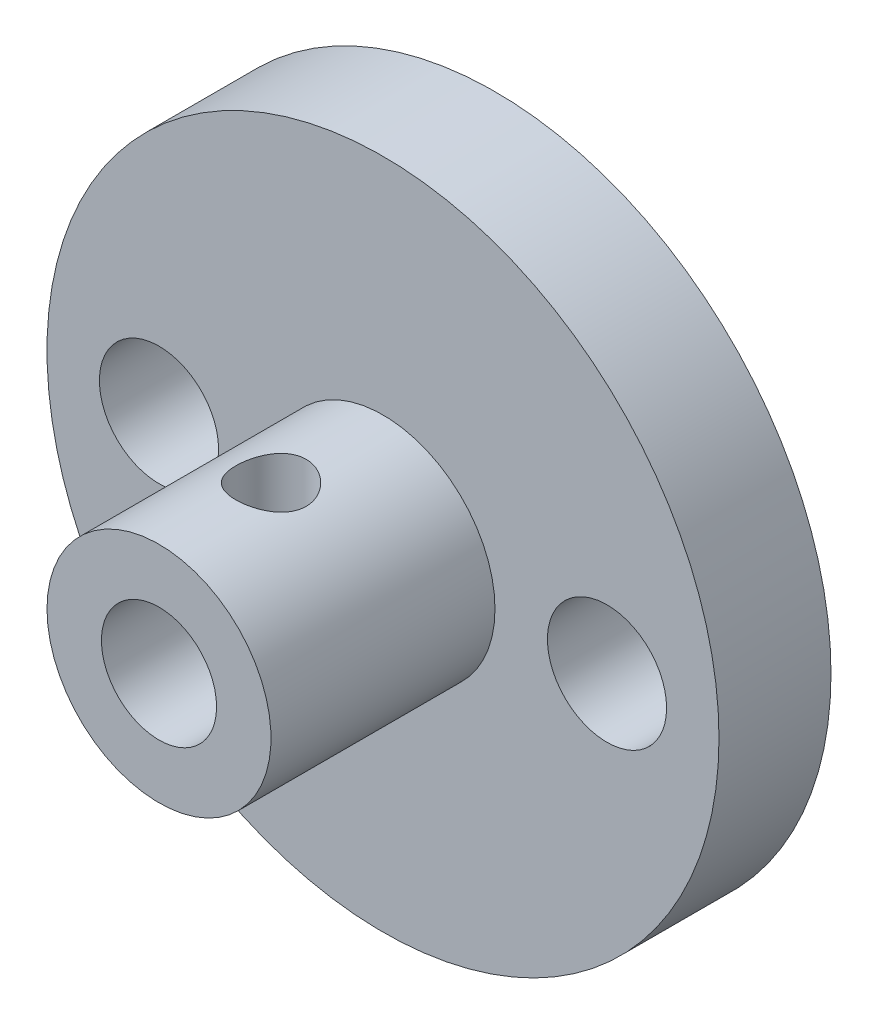
ISO-10303-21;
HEADER;
FILE_DESCRIPTION(('STEP AP214'),'2;1');
FILE_NAME('part.step','',(''),(''),'','','');
FILE_SCHEMA(('AUTOMOTIVE_DESIGN { 1 0 10303 214 1 1 1 1 }'));
ENDSEC;
DATA;
#1=APPLICATION_CONTEXT('core data for automotive mechanical design processes');
#2=APPLICATION_PROTOCOL_DEFINITION('international standard','automotive_design',2000,#1);
#3=PRODUCT_CONTEXT('',#1,'mechanical');
#4=PRODUCT('Part','Part','',(#3));
#5=PRODUCT_RELATED_PRODUCT_CATEGORY('part','',(#4));
#6=PRODUCT_DEFINITION_FORMATION('','',#4);
#7=PRODUCT_DEFINITION_CONTEXT('part definition',#1,'design');
#8=PRODUCT_DEFINITION('design','',#6,#7);
#9=PRODUCT_DEFINITION_SHAPE('','',#8);
#10=(LENGTH_UNIT() NAMED_UNIT(*) SI_UNIT(.MILLI.,.METRE.));
#11=(NAMED_UNIT(*) PLANE_ANGLE_UNIT() SI_UNIT($,.RADIAN.));
#12=(NAMED_UNIT(*) SI_UNIT($,.STERADIAN.) SOLID_ANGLE_UNIT());
#13=UNCERTAINTY_MEASURE_WITH_UNIT(LENGTH_MEASURE(1.E-05),#10,'distance_accuracy_value','');
#14=(GEOMETRIC_REPRESENTATION_CONTEXT(3) GLOBAL_UNCERTAINTY_ASSIGNED_CONTEXT((#13)) GLOBAL_UNIT_ASSIGNED_CONTEXT((#10,
#11,#12)) REPRESENTATION_CONTEXT('',''));
#15=CARTESIAN_POINT('',(0.,0.,0.));
#16=DIRECTION('',(0.,0.,1.));
#17=DIRECTION('',(1.,0.,0.));
#18=AXIS2_PLACEMENT_3D('',#15,#16,#17);
#19=CARTESIAN_POINT('',(0.,0.,6.35));
#20=DIRECTION('',(0.,0.,-1.));
#21=DIRECTION('',(-1.,0.,0.));
#22=AXIS2_PLACEMENT_3D('',#19,#20,#21);
#23=CYLINDRICAL_SURFACE('',#22,19.05);
#24=CARTESIAN_POINT('',(0.,0.,6.35));
#25=DIRECTION('',(0.,0.,1.));
#26=DIRECTION('',(1.,0.,0.));
#27=AXIS2_PLACEMENT_3D('',#24,#25,#26);
#28=CIRCLE('',#27,19.05);
#29=CARTESIAN_POINT('',(19.05,0.,6.35));
#30=VERTEX_POINT('',#29);
#31=EDGE_CURVE('E51',#30,#30,#28,.T.);
#32=ORIENTED_EDGE('',*,*,#31,.F.);
#33=EDGE_LOOP('',(#32));
#34=FACE_BOUND('',#33,.T.);
#35=CARTESIAN_POINT('',(0.,0.,0.));
#36=DIRECTION('',(0.,0.,1.));
#37=DIRECTION('',(1.,0.,0.));
#38=AXIS2_PLACEMENT_3D('',#35,#36,#37);
#39=CIRCLE('',#38,19.05);
#40=CARTESIAN_POINT('',(19.05,0.,0.));
#41=VERTEX_POINT('',#40);
#42=EDGE_CURVE('E56',#41,#41,#39,.T.);
#43=ORIENTED_EDGE('',*,*,#42,.T.);
#44=EDGE_LOOP('',(#43));
#45=FACE_BOUND('',#44,.T.);
#46=ADVANCED_FACE('F36',(#34,#45),#23,.T.);
#47=CARTESIAN_POINT('',(0.,0.,6.35));
#48=DIRECTION('',(0.,0.,1.));
#49=DIRECTION('',(1.,0.,0.));
#50=AXIS2_PLACEMENT_3D('',#47,#48,#49);
#51=PLANE('',#50);
#52=CARTESIAN_POINT('',(-12.7,0.,6.35));
#53=DIRECTION('',(0.,0.,1.));
#54=DIRECTION('',(1.,0.,0.));
#55=AXIS2_PLACEMENT_3D('',#52,#53,#54);
#56=CIRCLE('',#55,3.3782);
#57=CARTESIAN_POINT('',(-9.3218,0.,6.35));
#58=VERTEX_POINT('',#57);
#59=EDGE_CURVE('E188',#58,#58,#56,.T.);
#60=ORIENTED_EDGE('',*,*,#59,.F.);
#61=EDGE_LOOP('',(#60));
#62=FACE_BOUND('',#61,.T.);
#63=CARTESIAN_POINT('',(12.7,0.,6.35));
#64=DIRECTION('',(0.,0.,1.));
#65=DIRECTION('',(1.,0.,0.));
#66=AXIS2_PLACEMENT_3D('',#63,#64,#65);
#67=CIRCLE('',#66,3.3782);
#68=CARTESIAN_POINT('',(16.0782,0.,6.35));
#69=VERTEX_POINT('',#68);
#70=EDGE_CURVE('E192',#69,#69,#67,.T.);
#71=ORIENTED_EDGE('',*,*,#70,.F.);
#72=EDGE_LOOP('',(#71));
#73=FACE_BOUND('',#72,.T.);
#74=CARTESIAN_POINT('',(0.,0.,6.35));
#75=DIRECTION('',(0.,0.,1.));
#76=DIRECTION('',(1.,0.,0.));
#77=AXIS2_PLACEMENT_3D('',#74,#75,#76);
#78=CIRCLE('',#77,6.35);
#79=CARTESIAN_POINT('',(6.35,0.,6.35));
#80=VERTEX_POINT('',#79);
#81=EDGE_CURVE('E47',#80,#80,#78,.T.);
#82=ORIENTED_EDGE('',*,*,#81,.F.);
#83=EDGE_LOOP('',(#82));
#84=FACE_BOUND('',#83,.T.);
#85=ORIENTED_EDGE('',*,*,#31,.T.);
#86=EDGE_LOOP('',(#85));
#87=FACE_BOUND('',#86,.T.);
#88=ADVANCED_FACE('F104',(#62,#73,#84,#87),#51,.T.);
#89=CARTESIAN_POINT('',(0.,0.,0.));
#90=DIRECTION('',(0.,0.,1.));
#91=DIRECTION('',(1.,0.,0.));
#92=AXIS2_PLACEMENT_3D('',#89,#90,#91);
#93=PLANE('',#92);
#94=CARTESIAN_POINT('',(-12.7,0.,0.));
#95=DIRECTION('',(0.,0.,1.));
#96=DIRECTION('',(1.,0.,0.));
#97=AXIS2_PLACEMENT_3D('',#94,#95,#96);
#98=CIRCLE('',#97,3.3782);
#99=CARTESIAN_POINT('',(-9.3218,0.,0.));
#100=VERTEX_POINT('',#99);
#101=EDGE_CURVE('E194',#100,#100,#98,.T.);
#102=ORIENTED_EDGE('',*,*,#101,.T.);
#103=EDGE_LOOP('',(#102));
#104=FACE_BOUND('',#103,.T.);
#105=CARTESIAN_POINT('',(12.7,0.,0.));
#106=DIRECTION('',(0.,0.,1.));
#107=DIRECTION('',(1.,0.,0.));
#108=AXIS2_PLACEMENT_3D('',#105,#106,#107);
#109=CIRCLE('',#108,3.3782);
#110=CARTESIAN_POINT('',(16.0782,0.,0.));
#111=VERTEX_POINT('',#110);
#112=EDGE_CURVE('E82',#111,#111,#109,.T.);
#113=ORIENTED_EDGE('',*,*,#112,.T.);
#114=EDGE_LOOP('',(#113));
#115=FACE_BOUND('',#114,.T.);
#116=CARTESIAN_POINT('',(0.,0.,0.));
#117=DIRECTION('',(0.,0.,1.));
#118=DIRECTION('',(1.,0.,0.));
#119=AXIS2_PLACEMENT_3D('',#116,#117,#118);
#120=CIRCLE('',#119,3.2639);
#121=CARTESIAN_POINT('',(3.2639,0.,0.));
#122=VERTEX_POINT('',#121);
#123=EDGE_CURVE('E65',#122,#122,#120,.T.);
#124=ORIENTED_EDGE('',*,*,#123,.T.);
#125=EDGE_LOOP('',(#124));
#126=FACE_BOUND('',#125,.T.);
#127=ORIENTED_EDGE('',*,*,#42,.F.);
#128=EDGE_LOOP('',(#127));
#129=FACE_BOUND('',#128,.T.);
#130=ADVANCED_FACE('F109',(#104,#115,#126,#129),#93,.F.);
#131=CARTESIAN_POINT('',(0.,0.,19.05));
#132=DIRECTION('',(0.,0.,-1.));
#133=DIRECTION('',(-1.,0.,0.));
#134=AXIS2_PLACEMENT_3D('',#131,#132,#133);
#135=CYLINDRICAL_SURFACE('',#134,6.35);
#136=CARTESIAN_POINT('',(0.,6.35,14.6939));
#137=CARTESIAN_POINT('',(0.109142424515965,6.34999950864101,14.6938993668474));
#138=CARTESIAN_POINT('',(0.218291585608996,6.34715960731566,14.684909111883));
#139=CARTESIAN_POINT('',(0.433396308370141,6.33610901299259,14.6492809866341));
#140=CARTESIAN_POINT('',(0.539351169773904,6.32789715116519,14.6226392757346));
#141=CARTESIAN_POINT('',(0.744934413045787,6.3069993872693,14.552696391505));
#142=CARTESIAN_POINT('',(0.844572363181503,6.29432045228127,14.5094211511906));
#143=CARTESIAN_POINT('',(1.03517750977861,6.26579660211444,14.4075504519169));
#144=CARTESIAN_POINT('',(1.12614331146468,6.24995117892164,14.3489525342053));
#145=CARTESIAN_POINT('',(1.29965595125812,6.21622322872785,14.216178728609));
#146=CARTESIAN_POINT('',(1.38189478048642,6.19829600400891,14.141611724822));
#147=CARTESIAN_POINT('',(1.53292935990833,6.16268293115634,13.9798491093218));
#148=CARTESIAN_POINT('',(1.60172257683863,6.14499712909144,13.8926511232062));
#149=CARTESIAN_POINT('',(1.72558939289344,6.1113888869269,13.7054278853662));
#150=CARTESIAN_POINT('',(1.78027712295014,6.09552156642879,13.605136508551));
#151=CARTESIAN_POINT('',(1.87188188811815,6.06801963542741,13.3962014952945));
#152=CARTESIAN_POINT('',(1.90880365565063,6.05638389793504,13.28756009205));
#153=CARTESIAN_POINT('',(1.96269938178266,6.03913033239249,13.0684865809423));
#154=CARTESIAN_POINT('',(1.98024511401063,6.03334046860898,12.958209066904));
#155=CARTESIAN_POINT('',(1.99667709691487,6.02792354991424,12.7361352417599));
#156=CARTESIAN_POINT('',(1.9955683630919,6.02829483849507,12.6243393469678));
#157=CARTESIAN_POINT('',(1.97516986158077,6.03500649567724,12.4071420175023));
#158=CARTESIAN_POINT('',(1.95660826619276,6.0411077838206,12.3016635604642));
#159=CARTESIAN_POINT('',(1.90301207506858,6.05820338859783,12.0954009171418));
#160=CARTESIAN_POINT('',(1.86797571324095,6.0691982298128,11.9946172354098));
#161=CARTESIAN_POINT('',(1.78191297292662,6.0950244200429,11.7988760111877));
#162=CARTESIAN_POINT('',(1.73065885678711,6.10990984982951,11.7040260413856));
#163=CARTESIAN_POINT('',(1.61377367933569,6.1418153759652,11.5240347664144));
#164=CARTESIAN_POINT('',(1.54813885324998,6.15883603080226,11.4388960124684));
#165=CARTESIAN_POINT('',(1.40078753893692,6.1940520371408,11.2766289993537));
#166=CARTESIAN_POINT('',(1.31847032025457,6.21226541453812,11.2000491514585));
#167=CARTESIAN_POINT('',(1.14193548893161,6.24712474923217,11.0616468329664));
#168=CARTESIAN_POINT('',(1.04771697843552,6.26377058810534,10.9998254767954));
#169=CARTESIAN_POINT('',(0.848989774607568,6.29379700685041,10.8923186185269));
#170=CARTESIAN_POINT('',(0.744405361134727,6.30715062882562,10.8467650468401));
#171=CARTESIAN_POINT('',(0.528540975789286,6.3288933580691,10.7740609072686));
#172=CARTESIAN_POINT('',(0.417263068780103,6.33728398779624,10.7469046953959));
#173=CARTESIAN_POINT('',(0.195824653860993,6.34790984564657,10.7127029485796));
#174=CARTESIAN_POINT('',(0.0857895291263954,6.35037215977706,10.7049150969045));
#175=CARTESIAN_POINT('',(-0.134027760762552,6.34953622865711,10.707576669356));
#176=CARTESIAN_POINT('',(-0.243809960868123,6.34623883391432,10.7180234008719));
#177=CARTESIAN_POINT('',(-0.457134314653854,6.33440325692757,10.7562622339418));
#178=CARTESIAN_POINT('',(-0.560763959057499,6.3259989155422,10.7836116589746));
#179=CARTESIAN_POINT('',(-0.761933820558179,6.30493416905284,10.8543384443772));
#180=CARTESIAN_POINT('',(-0.859473281703205,6.29227323683426,10.8977177898768));
#181=CARTESIAN_POINT('',(-1.04835505145096,6.26360971884873,11.0004617190473));
#182=CARTESIAN_POINT('',(-1.13948670880164,6.24753279464779,11.0601922471443));
#183=CARTESIAN_POINT('',(-1.31068174676028,6.21387461170749,11.1935046233422));
#184=CARTESIAN_POINT('',(-1.39074208769878,6.19629294197134,11.2670902623695));
#185=CARTESIAN_POINT('',(-1.5408492519811,6.16072053435969,11.4295156440242));
#186=CARTESIAN_POINT('',(-1.61036692960277,6.14274159533369,11.5188481037609));
#187=CARTESIAN_POINT('',(-1.73347348962847,6.10914524923092,11.7083012131996));
#188=CARTESIAN_POINT('',(-1.78706260211608,6.09352780804459,11.8084217070431));
#189=CARTESIAN_POINT('',(-1.87646264341368,6.06659483531378,12.0164174000687));
#190=CARTESIAN_POINT('',(-1.91234045734819,6.05526315750055,12.1242616356953));
#191=CARTESIAN_POINT('',(-1.96529675070837,6.03828593574938,12.3448900786379));
#192=CARTESIAN_POINT('',(-1.98238247291594,6.03263820119737,12.4576723653085));
#193=CARTESIAN_POINT('',(-1.99674622415629,6.02789807649294,12.6794394758629));
#194=CARTESIAN_POINT('',(-1.99489300505472,6.02851815929831,12.788362575933));
#195=CARTESIAN_POINT('',(-1.97353154453667,6.03554444806881,13.0042637531758));
#196=CARTESIAN_POINT('',(-1.95402414162338,6.04195037922924,13.111241922479));
#197=CARTESIAN_POINT('',(-1.89849203852647,6.05962471072329,13.3186465897941));
#198=CARTESIAN_POINT('',(-1.86271821828398,6.07081910764052,13.4191470442401));
#199=CARTESIAN_POINT('',(-1.77586667739018,6.09678953009283,13.6127992781912));
#200=CARTESIAN_POINT('',(-1.72478582227171,6.1115662890804,13.7059495476366));
#201=CARTESIAN_POINT('',(-1.60641400397725,6.14376367421098,13.8862351943301));
#202=CARTESIAN_POINT('',(-1.53856309174027,6.16126559865635,13.9729883606489));
#203=CARTESIAN_POINT('',(-1.38955976877091,6.19656983110279,14.1341587273513));
#204=CARTESIAN_POINT('',(-1.30840378654074,6.21437221860339,14.2085726046653));
#205=CARTESIAN_POINT('',(-1.13186415961229,6.2489780563446,14.3454175883287));
#206=CARTESIAN_POINT('',(-1.03609865622246,6.26572897702007,14.4073708449297));
#207=CARTESIAN_POINT('',(-0.83498677166474,6.2956817456949,14.5142180251358));
#208=CARTESIAN_POINT('',(-0.729644086746069,6.30888495519298,14.5591184958007));
#209=CARTESIAN_POINT('',(-0.52126180163263,6.32936307555888,14.6274195048582));
#210=CARTESIAN_POINT('',(-0.418737660862818,6.33703431743766,14.6522773289142));
#211=CARTESIAN_POINT('',(-0.210810707580629,6.34735249690425,14.6855161768332));
#212=CARTESIAN_POINT('',(-0.105408495552603,6.35000047454886,14.6939006114915));
#213=CARTESIAN_POINT('',(0.,6.35,14.6939));
#214=B_SPLINE_CURVE_WITH_KNOTS('',3,(#136,#137,#138,#139,#140,#141,#142,#143,#144,#145,#146,
#147,#148,#149,#150,#151,#152,#153,#154,#155,#156,#157,#158,#159,#160,#161,#162,#163,#164,#165,
#166,#167,#168,#169,#170,#171,#172,#173,#174,#175,#176,#177,#178,#179,#180,#181,#182,#183,#184,
#185,#186,#187,#188,#189,#190,#191,#192,#193,#194,#195,#196,#197,#198,#199,#200,#201,#202,#203,
#204,#205,#206,#207,#208,#209,#210,#211,#212,#213),.UNSPECIFIED.,.T.,.F.,(4,2,2,2,2,2,2,2,2,2,2,
2,2,2,2,2,2,2,2,2,2,2,2,2,2,2,2,2,2,2,2,2,2,2,2,2,2,2,4),(0.,0.327039794601109,
0.654150770107317,0.980753808386344,1.30740928719355,1.6432343318785,1.97912258788404,
2.32340575728383,2.66759716716544,3.00133523160018,3.33498356756126,3.65530136581391,
3.97565350989725,4.30072030017859,4.62587229267335,4.96597665694514,5.3061066946611,
5.64893566173839,5.99165940720171,6.32103016563061,6.65035229162463,6.97139504967186,
7.29247757867589,7.62143461219055,7.9504817834778,8.29270103060333,8.63491533422927,
8.97582721691089,9.31660766044098,9.64182893700888,9.96703476767652,10.2873866370494,
10.6078041507082,10.9408610188357,11.2740074366891,11.6181749211563,11.962210135834,
12.2781268168495,12.5939780808068),.UNSPECIFIED.);
#215=CARTESIAN_POINT('',(0.,6.35,14.6939));
#216=VERTEX_POINT('',#215);
#217=EDGE_CURVE('E10',#216,#216,#214,.T.);
#218=ORIENTED_EDGE('',*,*,#217,.F.);
#219=EDGE_LOOP('',(#218));
#220=FACE_BOUND('',#219,.T.);
#221=ORIENTED_EDGE('',*,*,#81,.T.);
#222=EDGE_LOOP('',(#221));
#223=FACE_BOUND('',#222,.T.);
#224=CARTESIAN_POINT('',(0.,0.,19.05));
#225=DIRECTION('',(0.,0.,-1.));
#226=DIRECTION('',(-1.,0.,0.));
#227=AXIS2_PLACEMENT_3D('',#224,#225,#226);
#228=CIRCLE('',#227,6.35);
#229=CARTESIAN_POINT('',(-6.35,0.,19.05));
#230=VERTEX_POINT('',#229);
#231=EDGE_CURVE('E59',#230,#230,#228,.T.);
#232=ORIENTED_EDGE('',*,*,#231,.T.);
#233=EDGE_LOOP('',(#232));
#234=FACE_BOUND('',#233,.T.);
#235=ADVANCED_FACE('F117',(#220,#223,#234),#135,.T.);
#236=CARTESIAN_POINT('',(0.,0.,19.05));
#237=DIRECTION('',(0.,0.,-1.));
#238=DIRECTION('',(-1.,0.,0.));
#239=AXIS2_PLACEMENT_3D('',#236,#237,#238);
#240=PLANE('',#239);
#241=CARTESIAN_POINT('',(0.,0.,19.05));
#242=DIRECTION('',(0.,0.,1.));
#243=DIRECTION('',(1.,0.,0.));
#244=AXIS2_PLACEMENT_3D('',#241,#242,#243);
#245=CIRCLE('',#244,3.2639);
#246=CARTESIAN_POINT('',(3.2639,0.,19.05));
#247=VERTEX_POINT('',#246);
#248=EDGE_CURVE('E69',#247,#247,#245,.T.);
#249=ORIENTED_EDGE('',*,*,#248,.F.);
#250=EDGE_LOOP('',(#249));
#251=FACE_BOUND('',#250,.T.);
#252=ORIENTED_EDGE('',*,*,#231,.F.);
#253=EDGE_LOOP('',(#252));
#254=FACE_BOUND('',#253,.T.);
#255=ADVANCED_FACE('F123',(#251,#254),#240,.F.);
#256=CARTESIAN_POINT('',(0.,0.,19.05));
#257=DIRECTION('',(0.,0.,1.));
#258=DIRECTION('',(1.,0.,0.));
#259=AXIS2_PLACEMENT_3D('',#256,#257,#258);
#260=CYLINDRICAL_SURFACE('',#259,3.2639);
#261=CARTESIAN_POINT('',(0.,3.2639,14.6939));
#262=CARTESIAN_POINT('',(0.101694243640138,3.26389325531924,14.6938926032186));
#263=CARTESIAN_POINT('',(0.203536941812698,3.25909587232235,14.6860656380271));
#264=CARTESIAN_POINT('',(0.40413130381376,3.24035890142403,14.6551636529329));
#265=CARTESIAN_POINT('',(0.502875564368964,3.22639894045284,14.6320546524288));
#266=CARTESIAN_POINT('',(0.69395737181333,3.19074715229511,14.5719090704772));
#267=CARTESIAN_POINT('',(0.786324037871585,3.16909368698864,14.5349415418547));
#268=CARTESIAN_POINT('',(0.963240339634351,3.11988057948823,14.4485725608853));
#269=CARTESIAN_POINT('',(1.04779143504146,3.0923220433789,14.3991734368111));
#270=CARTESIAN_POINT('',(1.21413710977215,3.03106721627736,14.2850747102484));
#271=CARTESIAN_POINT('',(1.29520259850382,2.99705988420205,14.2194823702546));
#272=CARTESIAN_POINT('',(1.44589235397792,2.92734484096397,14.076885586211));
#273=CARTESIAN_POINT('',(1.51550138740583,2.89163494598502,13.9998662024494));
#274=CARTESIAN_POINT('',(1.6503634398329,2.81709135455649,13.825010578464));
#275=CARTESIAN_POINT('',(1.71391530144616,2.77844372758778,13.7257715133739));
#276=CARTESIAN_POINT('',(1.8232220621941,2.70797879028997,13.5157518443189));
#277=CARTESIAN_POINT('',(1.86900641093119,2.67615021697113,13.4049907279707));
#278=CARTESIAN_POINT('',(1.93149008648612,2.63125163049911,13.2031810973821));
#279=CARTESIAN_POINT('',(1.95259440710578,2.61548344634356,13.1140999197569));
#280=CARTESIAN_POINT('',(1.98238357777402,2.59298284072272,12.9328136438415));
#281=CARTESIAN_POINT('',(1.99108475840957,2.58623853868793,12.8406128171853));
#282=CARTESIAN_POINT('',(1.99555690807524,2.58279048772348,12.6554970358026));
#283=CARTESIAN_POINT('',(1.99129901073212,2.58610915401566,12.5625809473393));
#284=CARTESIAN_POINT('',(1.97006950192511,2.6023137595599,12.3790432613344));
#285=CARTESIAN_POINT('',(1.95308803902867,2.61520711210353,12.2884234979963));
#286=CARTESIAN_POINT('',(1.90773816818314,2.64846029154587,12.1132920543788));
#287=CARTESIAN_POINT('',(1.87956826980533,2.66868944643559,12.0287027197621));
#288=CARTESIAN_POINT('',(1.81290579743343,2.7144145014275,11.8652481076739));
#289=CARTESIAN_POINT('',(1.77440950172941,2.73991229962519,11.7863849069905));
#290=CARTESIAN_POINT('',(1.68020324270568,2.79885158204879,11.6215191357815));
#291=CARTESIAN_POINT('',(1.62264152521472,2.83289658855656,11.536790291604));
#292=CARTESIAN_POINT('',(1.49549302473121,2.9020323386282,11.3772922134624));
#293=CARTESIAN_POINT('',(1.42589433630806,2.93712408878795,11.3025329710494));
#294=CARTESIAN_POINT('',(1.26426014928771,3.0105975101211,11.1536853325737));
#295=CARTESIAN_POINT('',(1.17042488888552,3.04868211880449,11.0813827933607));
#296=CARTESIAN_POINT('',(0.969664190477247,3.11834241484085,10.9537148906303));
#297=CARTESIAN_POINT('',(0.862745075119407,3.14992122641436,10.8983413912199));
#298=CARTESIAN_POINT('',(0.645124345977512,3.2013424992061,10.8099202638736));
#299=CARTESIAN_POINT('',(0.535028376378675,3.22177247330729,10.7757383162135));
#300=CARTESIAN_POINT('',(0.309165639009145,3.25121056790396,10.7268413298073));
#301=CARTESIAN_POINT('',(0.193406389509794,3.26023342626145,10.712101171425));
#302=CARTESIAN_POINT('',(-0.0226918809486506,3.26535376213499,10.7037216126018));
#303=CARTESIAN_POINT('',(-0.122898370303859,3.26309756631935,10.7073947799784));
#304=CARTESIAN_POINT('',(-0.321021709749806,3.24959065005142,10.7295907356679));
#305=CARTESIAN_POINT('',(-0.418938649020737,3.2383402805336,10.7481129446014));
#306=CARTESIAN_POINT('',(-0.606822342671244,3.20836390152443,10.798269084159));
#307=CARTESIAN_POINT('',(-0.696940423537243,3.18987608894318,10.8294863581661));
#308=CARTESIAN_POINT('',(-0.870608935705203,3.14691819919078,10.9037251492609));
#309=CARTESIAN_POINT('',(-0.954158160430378,3.12244702636441,10.9467488284793));
#310=CARTESIAN_POINT('',(-1.12162434331303,3.06652496218129,11.0482888639288));
#311=CARTESIAN_POINT('',(-1.20469548838672,3.03461508429204,11.1079434692504));
#312=CARTESIAN_POINT('',(-1.36026040847244,2.96814878939551,11.2386076412783));
#313=CARTESIAN_POINT('',(-1.43274184911086,2.93358935660535,11.3096302503545));
#314=CARTESIAN_POINT('',(-1.57532707662415,2.85983773432669,11.4723047628409));
#315=CARTESIAN_POINT('',(-1.64374414205295,2.8206596290454,11.5654498865994));
#316=CARTESIAN_POINT('',(-1.76409762433086,2.7469958309423,11.7635205667596));
#317=CARTESIAN_POINT('',(-1.81604901503706,2.71250589111035,11.8684353016335));
#318=CARTESIAN_POINT('',(-1.89222241315405,2.65973885363417,12.0646248769845));
#319=CARTESIAN_POINT('',(-1.92000112329015,2.63957124094452,12.1540038052399));
#320=CARTESIAN_POINT('',(-1.96286030087244,2.60786241374703,12.3371859437388));
#321=CARTESIAN_POINT('',(-1.97795944671043,2.59630851312213,12.4309824303968));
#322=CARTESIAN_POINT('',(-1.99462023050148,2.58353546659354,12.6209376020117));
#323=CARTESIAN_POINT('',(-1.99612010836542,2.58236346990665,12.7171050767923));
#324=CARTESIAN_POINT('',(-1.98530936820949,2.59068129662992,12.9082128528478));
#325=CARTESIAN_POINT('',(-1.97299224210694,2.60017614433827,13.0031525545034));
#326=CARTESIAN_POINT('',(-1.93651666363307,2.62743491919855,13.1831812867791));
#327=CARTESIAN_POINT('',(-1.9131352310762,2.64465283743551,13.2685167456712));
#328=CARTESIAN_POINT('',(-1.855924801905,2.68510881934054,13.4340711840703));
#329=CARTESIAN_POINT('',(-1.82209176437624,2.70834921092247,13.5142881701184));
#330=CARTESIAN_POINT('',(-1.73909840256388,2.76249563527769,13.6803269642158));
#331=CARTESIAN_POINT('',(-1.68839637342864,2.7940291113562,13.7651707550096));
#332=CARTESIAN_POINT('',(-1.57552062934113,2.85920170429462,13.9259849928749));
#333=CARTESIAN_POINT('',(-1.51333741467631,2.89284254948258,14.0019480062192));
#334=CARTESIAN_POINT('',(-1.36625904576137,2.9655081280342,14.1568154520806));
#335=CARTESIAN_POINT('',(-1.27929109482279,3.00442184896719,14.2338239790086));
#336=CARTESIAN_POINT('',(-1.09193681263778,3.07747350230866,14.3723929597494));
#337=CARTESIAN_POINT('',(-0.991544304325281,3.11160922131833,14.4339462643772));
#338=CARTESIAN_POINT('',(-0.781104046417255,3.17089798008227,14.5382061736422));
#339=CARTESIAN_POINT('',(-0.671256581577811,3.1961981012443,14.5812244705605));
#340=CARTESIAN_POINT('',(-0.501010574904519,3.22573578794909,14.6308367166957));
#341=CARTESIAN_POINT('',(-0.443410227859834,3.23417531821784,14.6448815975236));
#342=CARTESIAN_POINT('',(-0.326850804517477,3.2480211308007,14.6678216621779));
#343=CARTESIAN_POINT('',(-0.267892843235905,3.25342981592601,14.6767209255558));
#344=CARTESIAN_POINT('',(-0.173978725197225,3.2594445568768,14.686600174408));
#345=CARTESIAN_POINT('',(-0.139262975458325,3.26111276362336,14.6893349557103));
#346=CARTESIAN_POINT('',(-0.0697039698600401,3.26334166997877,14.6929861835276));
#347=CARTESIAN_POINT('',(-0.0348607074729938,3.2639023120713,14.6939025356109));
#348=CARTESIAN_POINT('',(0.,3.2639,14.6939));
#349=B_SPLINE_CURVE_WITH_KNOTS('',3,(#261,#262,#263,#264,#265,#266,#267,#268,#269,#270,#271,
#272,#273,#274,#275,#276,#277,#278,#279,#280,#281,#282,#283,#284,#285,#286,#287,#288,#289,#290,
#291,#292,#293,#294,#295,#296,#297,#298,#299,#300,#301,#302,#303,#304,#305,#306,#307,#308,#309,
#310,#311,#312,#313,#314,#315,#316,#317,#318,#319,#320,#321,#322,#323,#324,#325,#326,#327,#328,
#329,#330,#331,#332,#333,#334,#335,#336,#337,#338,#339,#340,#341,#342,#343,#344,#345,#346,#347,
#348),.UNSPECIFIED.,.T.,.F.,(4,2,2,2,2,2,2,2,2,2,2,2,2,2,2,2,2,2,2,2,2,2,2,2,2,2,2,2,2,2,2,2,2,
2,2,2,2,2,2,2,2,2,2,4),(0.,0.304941382384372,0.610563112026259,0.914681836090089,
1.21874364509574,1.54651604842846,1.87472082034964,2.24498185734241,2.61462653940915,
2.89214138658242,3.16929050542392,3.44705742598659,3.72503963474449,3.99829559152458,
4.27165016440041,4.59425541868147,4.91718159687911,5.28859067770517,5.65982098218383,
6.00891667468422,6.35756087710612,6.65693769032055,6.95630282302741,7.24654743426335,
7.53684523409012,7.85699740998034,8.17751956058075,8.54196158652775,8.90607123218766,
9.19214304702664,9.47779270368208,9.76473897134615,10.0518204531605,10.3211993203725,
10.5906824684316,10.9007897375586,11.2111547536054,11.5769275802781,11.9428692935498,
12.3023911142785,12.4817908321392,12.6610481224906,12.7655763626861,12.8701100309371),.UNSPECIFIED.);
#350=CARTESIAN_POINT('',(0.,3.2639,14.6939));
#351=VERTEX_POINT('',#350);
#352=EDGE_CURVE('E73',#351,#351,#349,.T.);
#353=ORIENTED_EDGE('',*,*,#352,.T.);
#354=EDGE_LOOP('',(#353));
#355=FACE_BOUND('',#354,.T.);
#356=ORIENTED_EDGE('',*,*,#123,.F.);
#357=EDGE_LOOP('',(#356));
#358=FACE_BOUND('',#357,.T.);
#359=ORIENTED_EDGE('',*,*,#248,.T.);
#360=EDGE_LOOP('',(#359));
#361=FACE_BOUND('',#360,.T.);
#362=ADVANCED_FACE('F84',(#355,#358,#361),#260,.F.);
#363=CARTESIAN_POINT('',(0.,6.35,12.7));
#364=DIRECTION('',(0.,1.,0.));
#365=DIRECTION('',(0.,0.,1.));
#366=AXIS2_PLACEMENT_3D('',#363,#364,#365);
#367=CYLINDRICAL_SURFACE('',#366,1.99389999999999);
#368=ORIENTED_EDGE('',*,*,#217,.T.);
#369=EDGE_LOOP('',(#368));
#370=FACE_BOUND('',#369,.T.);
#371=ORIENTED_EDGE('',*,*,#352,.F.);
#372=EDGE_LOOP('',(#371));
#373=FACE_BOUND('',#372,.T.);
#374=ADVANCED_FACE('F87',(#370,#373),#367,.F.);
#375=CARTESIAN_POINT('',(12.7,0.,6.35));
#376=DIRECTION('',(0.,0.,1.));
#377=DIRECTION('',(1.,0.,0.));
#378=AXIS2_PLACEMENT_3D('',#375,#376,#377);
#379=CYLINDRICAL_SURFACE('',#378,3.3782);
#380=ORIENTED_EDGE('',*,*,#112,.F.);
#381=EDGE_LOOP('',(#380));
#382=FACE_BOUND('',#381,.T.);
#383=ORIENTED_EDGE('',*,*,#70,.T.);
#384=EDGE_LOOP('',(#383));
#385=FACE_BOUND('',#384,.T.);
#386=ADVANCED_FACE('F91',(#382,#385),#379,.F.);
#387=CARTESIAN_POINT('',(-12.7,0.,6.35));
#388=DIRECTION('',(0.,0.,1.));
#389=DIRECTION('',(1.,0.,0.));
#390=AXIS2_PLACEMENT_3D('',#387,#388,#389);
#391=CYLINDRICAL_SURFACE('',#390,3.3782);
#392=ORIENTED_EDGE('',*,*,#101,.F.);
#393=EDGE_LOOP('',(#392));
#394=FACE_BOUND('',#393,.T.);
#395=ORIENTED_EDGE('',*,*,#59,.T.);
#396=EDGE_LOOP('',(#395));
#397=FACE_BOUND('',#396,.T.);
#398=ADVANCED_FACE('F95',(#394,#397),#391,.F.);
#399=CLOSED_SHELL('',(#46,#88,#130,#235,#255,#362,#374,#386,#398));
#400=MANIFOLD_SOLID_BREP('B2',#399);
#401=ADVANCED_BREP_SHAPE_REPRESENTATION('',(#18,#400),#14);
#402=SHAPE_DEFINITION_REPRESENTATION(#9,#401);
ENDSEC;
END-ISO-10303-21;
